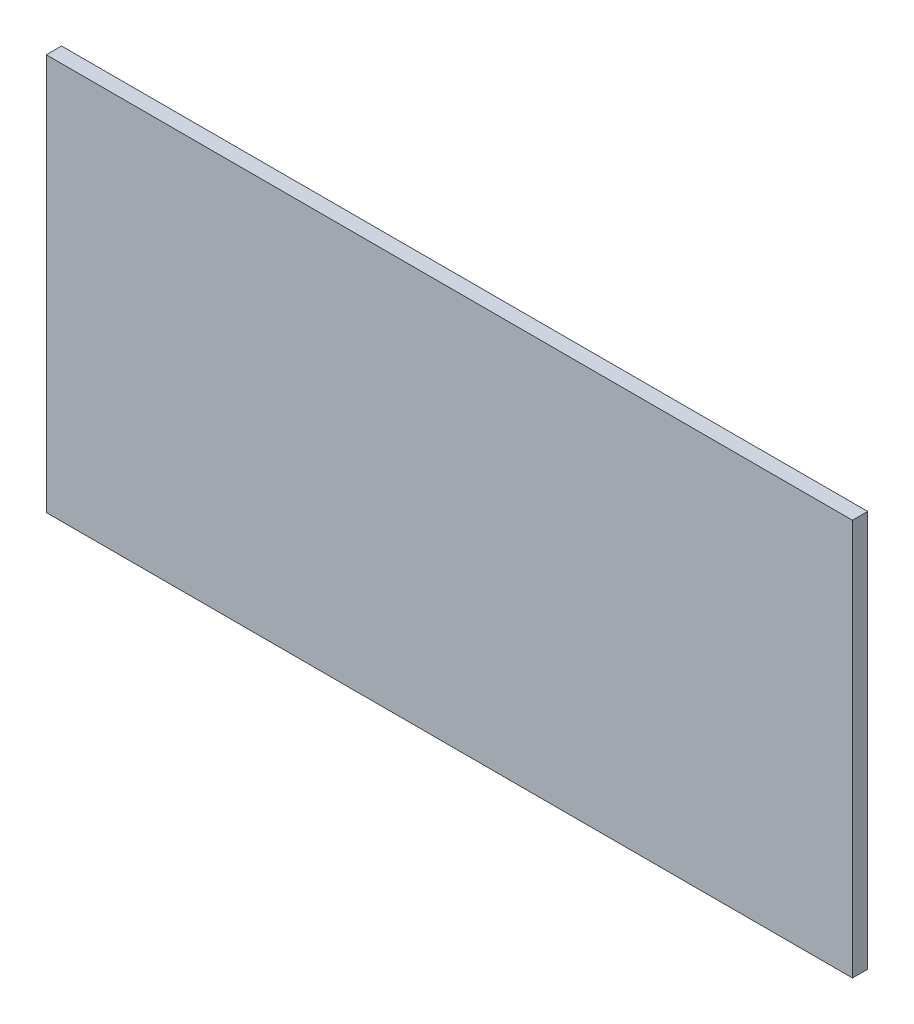
ISO-10303-21;
HEADER;
FILE_DESCRIPTION(('STEP AP214'),'2;1');
FILE_NAME('part.step','',(''),(''),'','','');
FILE_SCHEMA(('AUTOMOTIVE_DESIGN { 1 0 10303 214 1 1 1 1 }'));
ENDSEC;
DATA;
#1=APPLICATION_CONTEXT('core data for automotive mechanical design processes');
#2=APPLICATION_PROTOCOL_DEFINITION('international standard','automotive_design',2000,#1);
#3=PRODUCT_CONTEXT('',#1,'mechanical');
#4=PRODUCT('Part','Part','',(#3));
#5=PRODUCT_RELATED_PRODUCT_CATEGORY('part','',(#4));
#6=PRODUCT_DEFINITION_FORMATION('','',#4);
#7=PRODUCT_DEFINITION_CONTEXT('part definition',#1,'design');
#8=PRODUCT_DEFINITION('design','',#6,#7);
#9=PRODUCT_DEFINITION_SHAPE('','',#8);
#10=(LENGTH_UNIT() NAMED_UNIT(*) SI_UNIT(.MILLI.,.METRE.));
#11=(NAMED_UNIT(*) PLANE_ANGLE_UNIT() SI_UNIT($,.RADIAN.));
#12=(NAMED_UNIT(*) SI_UNIT($,.STERADIAN.) SOLID_ANGLE_UNIT());
#13=UNCERTAINTY_MEASURE_WITH_UNIT(LENGTH_MEASURE(1.E-05),#10,'distance_accuracy_value','');
#14=(GEOMETRIC_REPRESENTATION_CONTEXT(3) GLOBAL_UNCERTAINTY_ASSIGNED_CONTEXT((#13)) GLOBAL_UNIT_ASSIGNED_CONTEXT((#10,
#11,#12)) REPRESENTATION_CONTEXT('',''));
#15=CARTESIAN_POINT('',(0.,0.,0.));
#16=DIRECTION('',(0.,0.,1.));
#17=DIRECTION('',(1.,0.,0.));
#18=AXIS2_PLACEMENT_3D('',#15,#16,#17);
#19=CARTESIAN_POINT('',(335.75625,165.1,12.7));
#20=DIRECTION('',(0.,-1.,0.));
#21=DIRECTION('',(1.,0.,0.));
#22=AXIS2_PLACEMENT_3D('',#19,#20,#21);
#23=PLANE('',#22);
#24=DIRECTION('',(-1.,0.,0.));
#25=VECTOR('',#24,1.);
#26=CARTESIAN_POINT('',(335.75625,165.1,0.));
#27=LINE('',#26,#25);
#28=CARTESIAN_POINT('',(335.75625,165.1,0.));
#29=VERTEX_POINT('',#28);
#30=CARTESIAN_POINT('',(-335.75625,165.1,0.));
#31=VERTEX_POINT('',#30);
#32=EDGE_CURVE('E95',#29,#31,#27,.T.);
#33=ORIENTED_EDGE('',*,*,#32,.T.);
#34=DIRECTION('',(0.,0.,-1.));
#35=VECTOR('',#34,1.);
#36=CARTESIAN_POINT('',(-335.75625,165.1,12.7));
#37=LINE('',#36,#35);
#38=CARTESIAN_POINT('',(-335.75625,165.1,12.7));
#39=VERTEX_POINT('',#38);
#40=EDGE_CURVE('E11',#39,#31,#37,.T.);
#41=ORIENTED_EDGE('',*,*,#40,.F.);
#42=DIRECTION('',(-1.,0.,0.));
#43=VECTOR('',#42,1.);
#44=CARTESIAN_POINT('',(335.75625,165.1,12.7));
#45=LINE('',#44,#43);
#46=CARTESIAN_POINT('',(335.75625,165.1,12.7));
#47=VERTEX_POINT('',#46);
#48=EDGE_CURVE('E81',#47,#39,#45,.T.);
#49=ORIENTED_EDGE('',*,*,#48,.F.);
#50=DIRECTION('',(0.,0.,-1.));
#51=VECTOR('',#50,1.);
#52=CARTESIAN_POINT('',(335.75625,165.1,12.7));
#53=LINE('',#52,#51);
#54=EDGE_CURVE('E48',#47,#29,#53,.T.);
#55=ORIENTED_EDGE('',*,*,#54,.T.);
#56=EDGE_LOOP('',(#33,#41,#49,#55));
#57=FACE_BOUND('',#56,.T.);
#58=ADVANCED_FACE('F32',(#57),#23,.F.);
#59=CARTESIAN_POINT('',(-335.75625,165.1,12.7));
#60=DIRECTION('',(1.,0.,0.));
#61=DIRECTION('',(0.,0.,-1.));
#62=AXIS2_PLACEMENT_3D('',#59,#60,#61);
#63=PLANE('',#62);
#64=DIRECTION('',(0.,-1.,0.));
#65=VECTOR('',#64,1.);
#66=CARTESIAN_POINT('',(-335.75625,165.1,0.));
#67=LINE('',#66,#65);
#68=CARTESIAN_POINT('',(-335.75625,-165.1,0.));
#69=VERTEX_POINT('',#68);
#70=EDGE_CURVE('E86',#31,#69,#67,.T.);
#71=ORIENTED_EDGE('',*,*,#70,.T.);
#72=DIRECTION('',(0.,0.,-1.));
#73=VECTOR('',#72,1.);
#74=CARTESIAN_POINT('',(-335.75625,-165.1,12.7));
#75=LINE('',#74,#73);
#76=CARTESIAN_POINT('',(-335.75625,-165.1,12.7));
#77=VERTEX_POINT('',#76);
#78=EDGE_CURVE('E40',#77,#69,#75,.T.);
#79=ORIENTED_EDGE('',*,*,#78,.F.);
#80=DIRECTION('',(0.,-1.,0.));
#81=VECTOR('',#80,1.);
#82=CARTESIAN_POINT('',(-335.75625,165.1,12.7));
#83=LINE('',#82,#81);
#84=EDGE_CURVE('E73',#39,#77,#83,.T.);
#85=ORIENTED_EDGE('',*,*,#84,.F.);
#86=ORIENTED_EDGE('',*,*,#40,.T.);
#87=EDGE_LOOP('',(#71,#79,#85,#86));
#88=FACE_BOUND('',#87,.T.);
#89=ADVANCED_FACE('F85',(#88),#63,.F.);
#90=CARTESIAN_POINT('',(335.75625,-165.1,12.7));
#91=DIRECTION('',(0.,-1.,0.));
#92=DIRECTION('',(1.,0.,0.));
#93=AXIS2_PLACEMENT_3D('',#90,#91,#92);
#94=PLANE('',#93);
#95=DIRECTION('',(-1.,0.,0.));
#96=VECTOR('',#95,1.);
#97=CARTESIAN_POINT('',(335.75625,-165.1,0.));
#98=LINE('',#97,#96);
#99=CARTESIAN_POINT('',(335.75625,-165.1,0.));
#100=VERTEX_POINT('',#99);
#101=EDGE_CURVE('E98',#100,#69,#98,.T.);
#102=ORIENTED_EDGE('',*,*,#101,.F.);
#103=DIRECTION('',(0.,0.,-1.));
#104=VECTOR('',#103,1.);
#105=CARTESIAN_POINT('',(335.75625,-165.1,12.7));
#106=LINE('',#105,#104);
#107=CARTESIAN_POINT('',(335.75625,-165.1,12.7));
#108=VERTEX_POINT('',#107);
#109=EDGE_CURVE('E62',#108,#100,#106,.T.);
#110=ORIENTED_EDGE('',*,*,#109,.F.);
#111=DIRECTION('',(-1.,0.,0.));
#112=VECTOR('',#111,1.);
#113=CARTESIAN_POINT('',(335.75625,-165.1,12.7));
#114=LINE('',#113,#112);
#115=EDGE_CURVE('E80',#108,#77,#114,.T.);
#116=ORIENTED_EDGE('',*,*,#115,.T.);
#117=ORIENTED_EDGE('',*,*,#78,.T.);
#118=EDGE_LOOP('',(#102,#110,#116,#117));
#119=FACE_BOUND('',#118,.T.);
#120=ADVANCED_FACE('F89',(#119),#94,.T.);
#121=CARTESIAN_POINT('',(335.75625,165.1,12.7));
#122=DIRECTION('',(1.,0.,0.));
#123=DIRECTION('',(0.,1.,0.));
#124=AXIS2_PLACEMENT_3D('',#121,#122,#123);
#125=PLANE('',#124);
#126=DIRECTION('',(0.,-1.,0.));
#127=VECTOR('',#126,1.);
#128=CARTESIAN_POINT('',(335.75625,165.1,0.));
#129=LINE('',#128,#127);
#130=EDGE_CURVE('E100',#29,#100,#129,.T.);
#131=ORIENTED_EDGE('',*,*,#130,.F.);
#132=ORIENTED_EDGE('',*,*,#54,.F.);
#133=DIRECTION('',(0.,-1.,0.));
#134=VECTOR('',#133,1.);
#135=CARTESIAN_POINT('',(335.75625,165.1,12.7));
#136=LINE('',#135,#134);
#137=EDGE_CURVE('E90',#47,#108,#136,.T.);
#138=ORIENTED_EDGE('',*,*,#137,.T.);
#139=ORIENTED_EDGE('',*,*,#109,.T.);
#140=EDGE_LOOP('',(#131,#132,#138,#139));
#141=FACE_BOUND('',#140,.T.);
#142=ADVANCED_FACE('F106',(#141),#125,.T.);
#143=CARTESIAN_POINT('',(0.,0.,12.7));
#144=DIRECTION('',(0.,0.,1.));
#145=DIRECTION('',(1.,0.,0.));
#146=AXIS2_PLACEMENT_3D('',#143,#144,#145);
#147=PLANE('',#146);
#148=ORIENTED_EDGE('',*,*,#48,.T.);
#149=ORIENTED_EDGE('',*,*,#84,.T.);
#150=ORIENTED_EDGE('',*,*,#115,.F.);
#151=ORIENTED_EDGE('',*,*,#137,.F.);
#152=EDGE_LOOP('',(#148,#149,#150,#151));
#153=FACE_BOUND('',#152,.T.);
#154=ADVANCED_FACE('F77',(#153),#147,.T.);
#155=CARTESIAN_POINT('',(0.,0.,0.));
#156=DIRECTION('',(0.,0.,1.));
#157=DIRECTION('',(1.,0.,0.));
#158=AXIS2_PLACEMENT_3D('',#155,#156,#157);
#159=PLANE('',#158);
#160=ORIENTED_EDGE('',*,*,#32,.F.);
#161=ORIENTED_EDGE('',*,*,#130,.T.);
#162=ORIENTED_EDGE('',*,*,#101,.T.);
#163=ORIENTED_EDGE('',*,*,#70,.F.);
#164=EDGE_LOOP('',(#160,#161,#162,#163));
#165=FACE_BOUND('',#164,.T.);
#166=ADVANCED_FACE('F105',(#165),#159,.F.);
#167=CLOSED_SHELL('',(#58,#89,#120,#142,#154,#166));
#168=MANIFOLD_SOLID_BREP('B2',#167);
#169=ADVANCED_BREP_SHAPE_REPRESENTATION('',(#18,#168),#14);
#170=SHAPE_DEFINITION_REPRESENTATION(#9,#169);
ENDSEC;
END-ISO-10303-21;
